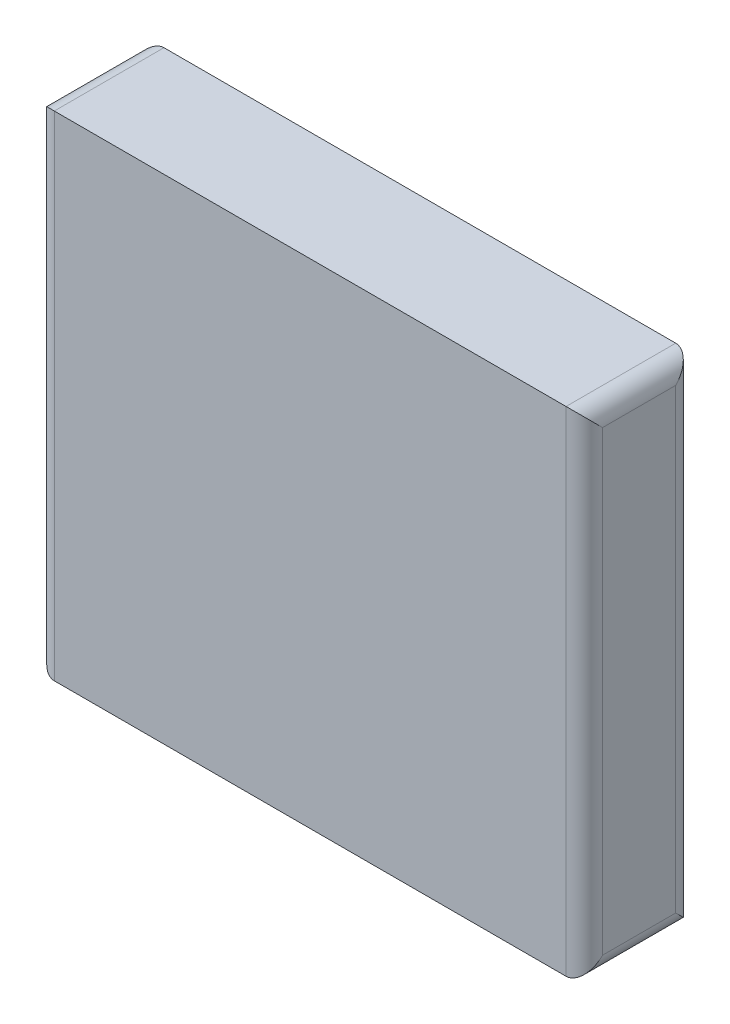
ISO-10303-21;
HEADER;
FILE_DESCRIPTION(('STEP AP214'),'2;1');
FILE_NAME('part.step','',(''),(''),'','','');
FILE_SCHEMA(('AUTOMOTIVE_DESIGN { 1 0 10303 214 1 1 1 1 }'));
ENDSEC;
DATA;
#1=APPLICATION_CONTEXT('core data for automotive mechanical design processes');
#2=APPLICATION_PROTOCOL_DEFINITION('international standard','automotive_design',2000,#1);
#3=PRODUCT_CONTEXT('',#1,'mechanical');
#4=PRODUCT('Part','Part','',(#3));
#5=PRODUCT_RELATED_PRODUCT_CATEGORY('part','',(#4));
#6=PRODUCT_DEFINITION_FORMATION('','',#4);
#7=PRODUCT_DEFINITION_CONTEXT('part definition',#1,'design');
#8=PRODUCT_DEFINITION('design','',#6,#7);
#9=PRODUCT_DEFINITION_SHAPE('','',#8);
#10=(LENGTH_UNIT() NAMED_UNIT(*) SI_UNIT(.MILLI.,.METRE.));
#11=(NAMED_UNIT(*) PLANE_ANGLE_UNIT() SI_UNIT($,.RADIAN.));
#12=(NAMED_UNIT(*) SI_UNIT($,.STERADIAN.) SOLID_ANGLE_UNIT());
#13=UNCERTAINTY_MEASURE_WITH_UNIT(LENGTH_MEASURE(1.E-05),#10,'distance_accuracy_value','');
#14=(GEOMETRIC_REPRESENTATION_CONTEXT(3) GLOBAL_UNCERTAINTY_ASSIGNED_CONTEXT((#13)) GLOBAL_UNIT_ASSIGNED_CONTEXT((#10,
#11,#12)) REPRESENTATION_CONTEXT('',''));
#15=CARTESIAN_POINT('',(0.,0.,0.));
#16=DIRECTION('',(0.,0.,1.));
#17=DIRECTION('',(1.,0.,0.));
#18=AXIS2_PLACEMENT_3D('',#15,#16,#17);
#19=CARTESIAN_POINT('',(0.,0.,6.));
#20=DIRECTION('',(1.,0.,0.));
#21=DIRECTION('',(0.,0.,-1.));
#22=AXIS2_PLACEMENT_3D('',#19,#20,#21);
#23=PLANE('',#22);
#24=DIRECTION('',(0.,-1.,0.));
#25=VECTOR('',#24,1.);
#26=CARTESIAN_POINT('',(0.,0.,1.));
#27=LINE('',#26,#25);
#28=CARTESIAN_POINT('',(0.,26.,1.));
#29=VERTEX_POINT('',#28);
#30=CARTESIAN_POINT('',(0.,1.,1.));
#31=VERTEX_POINT('',#30);
#32=EDGE_CURVE('E154',#29,#31,#27,.T.);
#33=ORIENTED_EDGE('',*,*,#32,.T.);
#34=DIRECTION('',(0.,0.,-1.));
#35=VECTOR('',#34,1.);
#36=CARTESIAN_POINT('',(0.,1.,6.));
#37=LINE('',#36,#35);
#38=CARTESIAN_POINT('',(0.,1.,5.));
#39=VERTEX_POINT('',#38);
#40=EDGE_CURVE('E109',#31,#39,#37,.F.);
#41=ORIENTED_EDGE('',*,*,#40,.T.);
#42=DIRECTION('',(0.,-1.,0.));
#43=VECTOR('',#42,1.);
#44=CARTESIAN_POINT('',(0.,0.,5.));
#45=LINE('',#44,#43);
#46=CARTESIAN_POINT('',(0.,26.,5.));
#47=VERTEX_POINT('',#46);
#48=EDGE_CURVE('E135',#39,#47,#45,.F.);
#49=ORIENTED_EDGE('',*,*,#48,.T.);
#50=DIRECTION('',(0.,0.,-1.));
#51=VECTOR('',#50,1.);
#52=CARTESIAN_POINT('',(0.,26.,6.));
#53=LINE('',#52,#51);
#54=EDGE_CURVE('E152',#47,#29,#53,.T.);
#55=ORIENTED_EDGE('',*,*,#54,.T.);
#56=EDGE_LOOP('',(#33,#41,#49,#55));
#57=FACE_BOUND('',#56,.T.);
#58=ADVANCED_FACE('F35',(#57),#23,.F.);
#59=CARTESIAN_POINT('',(0.,0.,6.));
#60=DIRECTION('',(0.,1.,0.));
#61=DIRECTION('',(0.,0.,1.));
#62=AXIS2_PLACEMENT_3D('',#59,#60,#61);
#63=PLANE('',#62);
#64=DIRECTION('',(1.,0.,0.));
#65=VECTOR('',#64,1.);
#66=CARTESIAN_POINT('',(0.,0.,6.));
#67=LINE('',#66,#65);
#68=CARTESIAN_POINT('',(1.,0.,6.));
#69=VERTEX_POINT('',#68);
#70=CARTESIAN_POINT('',(29.,0.,6.));
#71=VERTEX_POINT('',#70);
#72=EDGE_CURVE('E133',#69,#71,#67,.T.);
#73=ORIENTED_EDGE('',*,*,#72,.F.);
#74=DIRECTION('',(0.,0.,-1.));
#75=VECTOR('',#74,1.);
#76=CARTESIAN_POINT('',(1.,0.,6.));
#77=LINE('',#76,#75);
#78=CARTESIAN_POINT('',(1.,0.,0.));
#79=VERTEX_POINT('',#78);
#80=EDGE_CURVE('E107',#69,#79,#77,.T.);
#81=ORIENTED_EDGE('',*,*,#80,.T.);
#82=DIRECTION('',(1.,0.,0.));
#83=VECTOR('',#82,1.);
#84=CARTESIAN_POINT('',(0.,0.,0.));
#85=LINE('',#84,#83);
#86=CARTESIAN_POINT('',(29.,0.,0.));
#87=VERTEX_POINT('',#86);
#88=EDGE_CURVE('E131',#79,#87,#85,.T.);
#89=ORIENTED_EDGE('',*,*,#88,.T.);
#90=DIRECTION('',(0.,0.,-1.));
#91=VECTOR('',#90,1.);
#92=CARTESIAN_POINT('',(29.,0.,6.));
#93=LINE('',#92,#91);
#94=EDGE_CURVE('E136',#87,#71,#93,.F.);
#95=ORIENTED_EDGE('',*,*,#94,.T.);
#96=EDGE_LOOP('',(#73,#81,#89,#95));
#97=FACE_BOUND('',#96,.T.);
#98=ADVANCED_FACE('F129',(#97),#63,.F.);
#99=CARTESIAN_POINT('',(30.,0.,6.));
#100=DIRECTION('',(-1.,0.,0.));
#101=DIRECTION('',(0.,0.,1.));
#102=AXIS2_PLACEMENT_3D('',#99,#100,#101);
#103=PLANE('',#102);
#104=DIRECTION('',(0.,1.,0.));
#105=VECTOR('',#104,1.);
#106=CARTESIAN_POINT('',(30.,0.,5.));
#107=LINE('',#106,#105);
#108=CARTESIAN_POINT('',(30.,26.,5.));
#109=VERTEX_POINT('',#108);
#110=CARTESIAN_POINT('',(30.,1.,5.));
#111=VERTEX_POINT('',#110);
#112=EDGE_CURVE('E165',#109,#111,#107,.F.);
#113=ORIENTED_EDGE('',*,*,#112,.T.);
#114=DIRECTION('',(0.,0.,-1.));
#115=VECTOR('',#114,1.);
#116=CARTESIAN_POINT('',(30.,1.,6.));
#117=LINE('',#116,#115);
#118=CARTESIAN_POINT('',(30.,1.,1.));
#119=VERTEX_POINT('',#118);
#120=EDGE_CURVE('E11',#111,#119,#117,.T.);
#121=ORIENTED_EDGE('',*,*,#120,.T.);
#122=DIRECTION('',(0.,1.,0.));
#123=VECTOR('',#122,1.);
#124=CARTESIAN_POINT('',(30.,27.,1.));
#125=LINE('',#124,#123);
#126=CARTESIAN_POINT('',(30.,26.,1.));
#127=VERTEX_POINT('',#126);
#128=EDGE_CURVE('E44',#119,#127,#125,.T.);
#129=ORIENTED_EDGE('',*,*,#128,.T.);
#130=DIRECTION('',(0.,0.,-1.));
#131=VECTOR('',#130,1.);
#132=CARTESIAN_POINT('',(30.,26.,6.));
#133=LINE('',#132,#131);
#134=EDGE_CURVE('E167',#127,#109,#133,.F.);
#135=ORIENTED_EDGE('',*,*,#134,.T.);
#136=EDGE_LOOP('',(#113,#121,#129,#135));
#137=FACE_BOUND('',#136,.T.);
#138=ADVANCED_FACE('F218',(#137),#103,.F.);
#139=CARTESIAN_POINT('',(0.,27.,6.));
#140=DIRECTION('',(0.,-1.,0.));
#141=DIRECTION('',(0.,0.,-1.));
#142=AXIS2_PLACEMENT_3D('',#139,#140,#141);
#143=PLANE('',#142);
#144=DIRECTION('',(-1.,0.,0.));
#145=VECTOR('',#144,1.);
#146=CARTESIAN_POINT('',(0.,27.,0.));
#147=LINE('',#146,#145);
#148=CARTESIAN_POINT('',(29.,27.,0.));
#149=VERTEX_POINT('',#148);
#150=CARTESIAN_POINT('',(1.,27.,0.));
#151=VERTEX_POINT('',#150);
#152=EDGE_CURVE('E140',#149,#151,#147,.T.);
#153=ORIENTED_EDGE('',*,*,#152,.T.);
#154=DIRECTION('',(0.,0.,-1.));
#155=VECTOR('',#154,1.);
#156=CARTESIAN_POINT('',(1.,27.,6.));
#157=LINE('',#156,#155);
#158=CARTESIAN_POINT('',(1.,27.,6.));
#159=VERTEX_POINT('',#158);
#160=EDGE_CURVE('E159',#151,#159,#157,.F.);
#161=ORIENTED_EDGE('',*,*,#160,.T.);
#162=DIRECTION('',(-1.,0.,0.));
#163=VECTOR('',#162,1.);
#164=CARTESIAN_POINT('',(0.,27.,6.));
#165=LINE('',#164,#163);
#166=CARTESIAN_POINT('',(29.,27.,6.));
#167=VERTEX_POINT('',#166);
#168=EDGE_CURVE('E147',#167,#159,#165,.T.);
#169=ORIENTED_EDGE('',*,*,#168,.F.);
#170=DIRECTION('',(0.,0.,-1.));
#171=VECTOR('',#170,1.);
#172=CARTESIAN_POINT('',(29.,27.,6.));
#173=LINE('',#172,#171);
#174=EDGE_CURVE('E123',#167,#149,#173,.T.);
#175=ORIENTED_EDGE('',*,*,#174,.T.);
#176=EDGE_LOOP('',(#153,#161,#169,#175));
#177=FACE_BOUND('',#176,.T.);
#178=ADVANCED_FACE('F189',(#177),#143,.F.);
#179=CARTESIAN_POINT('',(0.,0.,6.));
#180=DIRECTION('',(0.,0.,-1.));
#181=DIRECTION('',(-1.,0.,0.));
#182=AXIS2_PLACEMENT_3D('',#179,#180,#181);
#183=PLANE('',#182);
#184=ORIENTED_EDGE('',*,*,#168,.T.);
#185=DIRECTION('',(0.,-1.,0.));
#186=VECTOR('',#185,1.);
#187=CARTESIAN_POINT('',(1.,0.,6.));
#188=LINE('',#187,#186);
#189=EDGE_CURVE('E163',#159,#69,#188,.T.);
#190=ORIENTED_EDGE('',*,*,#189,.T.);
#191=ORIENTED_EDGE('',*,*,#72,.T.);
#192=DIRECTION('',(0.,1.,0.));
#193=VECTOR('',#192,1.);
#194=CARTESIAN_POINT('',(29.,0.,6.));
#195=LINE('',#194,#193);
#196=EDGE_CURVE('E161',#71,#167,#195,.T.);
#197=ORIENTED_EDGE('',*,*,#196,.T.);
#198=EDGE_LOOP('',(#184,#190,#191,#197));
#199=FACE_BOUND('',#198,.T.);
#200=ADVANCED_FACE('F194',(#199),#183,.F.);
#201=CARTESIAN_POINT('',(0.,0.,0.));
#202=DIRECTION('',(0.,0.,-1.));
#203=DIRECTION('',(-1.,0.,0.));
#204=AXIS2_PLACEMENT_3D('',#201,#202,#203);
#205=PLANE('',#204);
#206=ORIENTED_EDGE('',*,*,#88,.F.);
#207=DIRECTION('',(0.,-1.,0.));
#208=VECTOR('',#207,1.);
#209=CARTESIAN_POINT('',(1.,27.,0.));
#210=LINE('',#209,#208);
#211=EDGE_CURVE('E115',#79,#151,#210,.F.);
#212=ORIENTED_EDGE('',*,*,#211,.T.);
#213=ORIENTED_EDGE('',*,*,#152,.F.);
#214=DIRECTION('',(0.,1.,0.));
#215=VECTOR('',#214,1.);
#216=CARTESIAN_POINT('',(29.,0.,0.));
#217=LINE('',#216,#215);
#218=EDGE_CURVE('E124',#149,#87,#217,.F.);
#219=ORIENTED_EDGE('',*,*,#218,.T.);
#220=EDGE_LOOP('',(#206,#212,#213,#219));
#221=FACE_BOUND('',#220,.T.);
#222=ADVANCED_FACE('F138',(#221),#205,.T.);
#223=CARTESIAN_POINT('',(1.,26.,6.));
#224=DIRECTION('',(0.,0.,-1.));
#225=DIRECTION('',(-1.,0.,0.));
#226=AXIS2_PLACEMENT_3D('',#223,#224,#225);
#227=CYLINDRICAL_SURFACE('',#226,1.);
#228=CARTESIAN_POINT('',(1.,26.,1.));
#229=DIRECTION('',(0.,-0.707106781186547,-0.707106781186547));
#230=DIRECTION('',(0.,0.707106781186547,-0.707106781186547));
#231=AXIS2_PLACEMENT_3D('',#228,#229,#230);
#232=ELLIPSE('',#231,1.41421356237309,1.);
#233=EDGE_CURVE('E118',#29,#151,#232,.T.);
#234=ORIENTED_EDGE('',*,*,#233,.F.);
#235=ORIENTED_EDGE('',*,*,#54,.F.);
#236=CARTESIAN_POINT('',(1.,26.,5.));
#237=DIRECTION('',(0.,-0.707106781186547,0.707106781186547));
#238=DIRECTION('',(0.,-0.707106781186547,-0.707106781186547));
#239=AXIS2_PLACEMENT_3D('',#236,#237,#238);
#240=ELLIPSE('',#239,1.41421356237309,1.);
#241=EDGE_CURVE('E141',#159,#47,#240,.T.);
#242=ORIENTED_EDGE('',*,*,#241,.F.);
#243=ORIENTED_EDGE('',*,*,#160,.F.);
#244=EDGE_LOOP('',(#234,#235,#242,#243));
#245=FACE_BOUND('',#244,.T.);
#246=ADVANCED_FACE('F202',(#245),#227,.T.);
#247=CARTESIAN_POINT('',(1.,0.,5.));
#248=DIRECTION('',(0.,-1.,0.));
#249=DIRECTION('',(0.,0.,-1.));
#250=AXIS2_PLACEMENT_3D('',#247,#248,#249);
#251=CYLINDRICAL_SURFACE('',#250,1.);
#252=ORIENTED_EDGE('',*,*,#241,.T.);
#253=ORIENTED_EDGE('',*,*,#48,.F.);
#254=CARTESIAN_POINT('',(1.,1.,5.));
#255=DIRECTION('',(0.,-0.707106781186547,-0.707106781186547));
#256=DIRECTION('',(0.,-0.707106781186547,0.707106781186547));
#257=AXIS2_PLACEMENT_3D('',#254,#255,#256);
#258=ELLIPSE('',#257,1.41421356237309,1.);
#259=EDGE_CURVE('E112',#69,#39,#258,.T.);
#260=ORIENTED_EDGE('',*,*,#259,.F.);
#261=ORIENTED_EDGE('',*,*,#189,.F.);
#262=EDGE_LOOP('',(#252,#253,#260,#261));
#263=FACE_BOUND('',#262,.T.);
#264=ADVANCED_FACE('F197',(#263),#251,.T.);
#265=CARTESIAN_POINT('',(1.,0.,1.));
#266=DIRECTION('',(0.,1.,0.));
#267=DIRECTION('',(0.,0.,1.));
#268=AXIS2_PLACEMENT_3D('',#265,#266,#267);
#269=CYLINDRICAL_SURFACE('',#268,1.);
#270=ORIENTED_EDGE('',*,*,#233,.T.);
#271=ORIENTED_EDGE('',*,*,#211,.F.);
#272=CARTESIAN_POINT('',(1.,1.,1.));
#273=DIRECTION('',(0.,0.707106781186547,-0.707106781186547));
#274=DIRECTION('',(0.,0.707106781186547,0.707106781186547));
#275=AXIS2_PLACEMENT_3D('',#272,#273,#274);
#276=ELLIPSE('',#275,1.41421356237309,1.);
#277=EDGE_CURVE('E103',#31,#79,#276,.F.);
#278=ORIENTED_EDGE('',*,*,#277,.F.);
#279=ORIENTED_EDGE('',*,*,#32,.F.);
#280=EDGE_LOOP('',(#270,#271,#278,#279));
#281=FACE_BOUND('',#280,.T.);
#282=ADVANCED_FACE('F116',(#281),#269,.T.);
#283=CARTESIAN_POINT('',(1.,1.,6.));
#284=DIRECTION('',(0.,0.,-1.));
#285=DIRECTION('',(-1.,0.,0.));
#286=AXIS2_PLACEMENT_3D('',#283,#284,#285);
#287=CYLINDRICAL_SURFACE('',#286,1.);
#288=ORIENTED_EDGE('',*,*,#259,.T.);
#289=ORIENTED_EDGE('',*,*,#40,.F.);
#290=ORIENTED_EDGE('',*,*,#277,.T.);
#291=ORIENTED_EDGE('',*,*,#80,.F.);
#292=EDGE_LOOP('',(#288,#289,#290,#291));
#293=FACE_BOUND('',#292,.T.);
#294=ADVANCED_FACE('F105',(#293),#287,.T.);
#295=CARTESIAN_POINT('',(29.,26.,6.));
#296=DIRECTION('',(0.,0.,-1.));
#297=DIRECTION('',(-1.,0.,0.));
#298=AXIS2_PLACEMENT_3D('',#295,#296,#297);
#299=CYLINDRICAL_SURFACE('',#298,1.);
#300=CARTESIAN_POINT('',(29.,26.,1.));
#301=DIRECTION('',(0.,-0.707106781186547,-0.707106781186547));
#302=DIRECTION('',(0.,0.707106781186547,-0.707106781186547));
#303=AXIS2_PLACEMENT_3D('',#300,#301,#302);
#304=ELLIPSE('',#303,1.41421356237309,1.);
#305=EDGE_CURVE('E174',#149,#127,#304,.T.);
#306=ORIENTED_EDGE('',*,*,#305,.F.);
#307=ORIENTED_EDGE('',*,*,#174,.F.);
#308=CARTESIAN_POINT('',(29.,26.,5.));
#309=DIRECTION('',(0.,0.707106781186547,-0.707106781186547));
#310=DIRECTION('',(0.,0.707106781186547,0.707106781186547));
#311=AXIS2_PLACEMENT_3D('',#308,#309,#310);
#312=ELLIPSE('',#311,1.41421356237309,1.);
#313=EDGE_CURVE('E39',#109,#167,#312,.F.);
#314=ORIENTED_EDGE('',*,*,#313,.F.);
#315=ORIENTED_EDGE('',*,*,#134,.F.);
#316=EDGE_LOOP('',(#306,#307,#314,#315));
#317=FACE_BOUND('',#316,.T.);
#318=ADVANCED_FACE('F37',(#317),#299,.T.);
#319=CARTESIAN_POINT('',(29.,0.,5.));
#320=DIRECTION('',(0.,1.,0.));
#321=DIRECTION('',(0.,0.,1.));
#322=AXIS2_PLACEMENT_3D('',#319,#320,#321);
#323=CYLINDRICAL_SURFACE('',#322,1.);
#324=ORIENTED_EDGE('',*,*,#313,.T.);
#325=ORIENTED_EDGE('',*,*,#196,.F.);
#326=CARTESIAN_POINT('',(29.,1.,5.));
#327=DIRECTION('',(0.,0.707106781186547,0.707106781186547));
#328=DIRECTION('',(0.,0.707106781186547,-0.707106781186547));
#329=AXIS2_PLACEMENT_3D('',#326,#327,#328);
#330=ELLIPSE('',#329,1.41421356237309,1.);
#331=EDGE_CURVE('E173',#111,#71,#330,.F.);
#332=ORIENTED_EDGE('',*,*,#331,.F.);
#333=ORIENTED_EDGE('',*,*,#112,.F.);
#334=EDGE_LOOP('',(#324,#325,#332,#333));
#335=FACE_BOUND('',#334,.T.);
#336=ADVANCED_FACE('F183',(#335),#323,.T.);
#337=CARTESIAN_POINT('',(29.,0.,1.));
#338=DIRECTION('',(0.,-1.,0.));
#339=DIRECTION('',(0.,0.,-1.));
#340=AXIS2_PLACEMENT_3D('',#337,#338,#339);
#341=CYLINDRICAL_SURFACE('',#340,1.);
#342=ORIENTED_EDGE('',*,*,#305,.T.);
#343=ORIENTED_EDGE('',*,*,#128,.F.);
#344=CARTESIAN_POINT('',(29.,1.,1.));
#345=DIRECTION('',(0.,-0.707106781186547,0.707106781186547));
#346=DIRECTION('',(0.,-0.707106781186547,-0.707106781186547));
#347=AXIS2_PLACEMENT_3D('',#344,#345,#346);
#348=ELLIPSE('',#347,1.41421356237309,1.);
#349=EDGE_CURVE('E52',#87,#119,#348,.T.);
#350=ORIENTED_EDGE('',*,*,#349,.F.);
#351=ORIENTED_EDGE('',*,*,#218,.F.);
#352=EDGE_LOOP('',(#342,#343,#350,#351));
#353=FACE_BOUND('',#352,.T.);
#354=ADVANCED_FACE('F246',(#353),#341,.T.);
#355=CARTESIAN_POINT('',(29.,1.,6.));
#356=DIRECTION('',(0.,0.,-1.));
#357=DIRECTION('',(-1.,0.,0.));
#358=AXIS2_PLACEMENT_3D('',#355,#356,#357);
#359=CYLINDRICAL_SURFACE('',#358,1.);
#360=ORIENTED_EDGE('',*,*,#331,.T.);
#361=ORIENTED_EDGE('',*,*,#94,.F.);
#362=ORIENTED_EDGE('',*,*,#349,.T.);
#363=ORIENTED_EDGE('',*,*,#120,.F.);
#364=EDGE_LOOP('',(#360,#361,#362,#363));
#365=FACE_BOUND('',#364,.T.);
#366=ADVANCED_FACE('F252',(#365),#359,.T.);
#367=CLOSED_SHELL('',(#58,#98,#138,#178,#200,#222,#246,#264,#282,#294,#318,#336,#354,#366));
#368=MANIFOLD_SOLID_BREP('B2',#367);
#369=ADVANCED_BREP_SHAPE_REPRESENTATION('',(#18,#368),#14);
#370=SHAPE_DEFINITION_REPRESENTATION(#9,#369);
ENDSEC;
END-ISO-10303-21;
